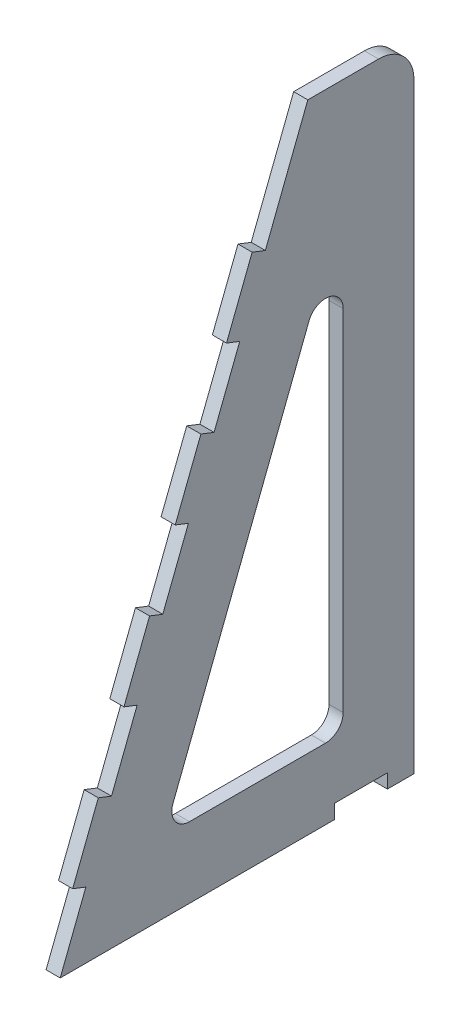
ISO-10303-21;
HEADER;
FILE_DESCRIPTION(('STEP AP214'),'2;1');
FILE_NAME('part.step','',(''),(''),'','','');
FILE_SCHEMA(('AUTOMOTIVE_DESIGN { 1 0 10303 214 1 1 1 1 }'));
ENDSEC;
DATA;
#1=APPLICATION_CONTEXT('core data for automotive mechanical design processes');
#2=APPLICATION_PROTOCOL_DEFINITION('international standard','automotive_design',2000,#1);
#3=PRODUCT_CONTEXT('',#1,'mechanical');
#4=PRODUCT('Part','Part','',(#3));
#5=PRODUCT_RELATED_PRODUCT_CATEGORY('part','',(#4));
#6=PRODUCT_DEFINITION_FORMATION('','',#4);
#7=PRODUCT_DEFINITION_CONTEXT('part definition',#1,'design');
#8=PRODUCT_DEFINITION('design','',#6,#7);
#9=PRODUCT_DEFINITION_SHAPE('','',#8);
#10=(LENGTH_UNIT() NAMED_UNIT(*) SI_UNIT(.MILLI.,.METRE.));
#11=(NAMED_UNIT(*) PLANE_ANGLE_UNIT() SI_UNIT($,.RADIAN.));
#12=(NAMED_UNIT(*) SI_UNIT($,.STERADIAN.) SOLID_ANGLE_UNIT());
#13=UNCERTAINTY_MEASURE_WITH_UNIT(LENGTH_MEASURE(1.E-05),#10,'distance_accuracy_value','');
#14=(GEOMETRIC_REPRESENTATION_CONTEXT(3) GLOBAL_UNCERTAINTY_ASSIGNED_CONTEXT((#13)) GLOBAL_UNIT_ASSIGNED_CONTEXT((#10,
#11,#12)) REPRESENTATION_CONTEXT('',''));
#15=CARTESIAN_POINT('',(0.,0.,0.));
#16=DIRECTION('',(0.,0.,1.));
#17=DIRECTION('',(1.,0.,0.));
#18=AXIS2_PLACEMENT_3D('',#15,#16,#17);
#19=CARTESIAN_POINT('',(4.,0.,0.));
#20=DIRECTION('',(0.,0.362446261154948,0.932004671541296));
#21=DIRECTION('',(0.,-0.932004671541296,0.362446261154948));
#22=AXIS2_PLACEMENT_3D('',#19,#20,#21);
#23=PLANE('',#22);
#24=DIRECTION('',(1.,0.,0.));
#25=VECTOR('',#24,1.);
#26=CARTESIAN_POINT('',(0.,130.480654015781,-50.7424765616928));
#27=LINE('',#26,#25);
#28=CARTESIAN_POINT('',(0.,130.480654015781,-50.7424765616928));
#29=VERTEX_POINT('',#28);
#30=CARTESIAN_POINT('',(4.,130.480654015781,-50.7424765616928));
#31=VERTEX_POINT('',#30);
#32=EDGE_CURVE('E268',#29,#31,#27,.T.);
#33=ORIENTED_EDGE('',*,*,#32,.F.);
#34=DIRECTION('',(0.,0.932004671541296,-0.362446261154948));
#35=VECTOR('',#34,1.);
#36=CARTESIAN_POINT('',(0.,0.,0.));
#37=LINE('',#36,#35);
#38=CARTESIAN_POINT('',(0.,111.840560584955,-43.4935513385938));
#39=VERTEX_POINT('',#38);
#40=EDGE_CURVE('E596',#39,#29,#37,.T.);
#41=ORIENTED_EDGE('',*,*,#40,.F.);
#42=DIRECTION('',(1.,0.,0.));
#43=VECTOR('',#42,1.);
#44=CARTESIAN_POINT('',(0.,111.840560584955,-43.4935513385938));
#45=LINE('',#44,#43);
#46=CARTESIAN_POINT('',(4.,111.840560584955,-43.4935513385938));
#47=VERTEX_POINT('',#46);
#48=EDGE_CURVE('E309',#39,#47,#45,.T.);
#49=ORIENTED_EDGE('',*,*,#48,.T.);
#50=DIRECTION('',(0.,0.932004671541296,-0.362446261154948));
#51=VECTOR('',#50,1.);
#52=CARTESIAN_POINT('',(4.,0.,0.));
#53=LINE('',#52,#51);
#54=EDGE_CURVE('E599',#47,#31,#53,.T.);
#55=ORIENTED_EDGE('',*,*,#54,.T.);
#56=EDGE_LOOP('',(#33,#41,#49,#55));
#57=FACE_BOUND('',#56,.T.);
#58=ADVANCED_FACE('F48',(#57),#23,.T.);
#59=DIRECTION('',(1.,0.,0.));
#60=VECTOR('',#59,1.);
#61=CARTESIAN_POINT('',(0.,93.2004671541295,-36.2446261154949));
#62=LINE('',#61,#60);
#63=CARTESIAN_POINT('',(0.,93.2004671541295,-36.2446261154949));
#64=VERTEX_POINT('',#63);
#65=CARTESIAN_POINT('',(4.,93.2004671541295,-36.2446261154949));
#66=VERTEX_POINT('',#65);
#67=EDGE_CURVE('E305',#64,#66,#62,.T.);
#68=ORIENTED_EDGE('',*,*,#67,.F.);
#69=CARTESIAN_POINT('',(0.,74.5603737233037,-28.9957008923959));
#70=VERTEX_POINT('',#69);
#71=EDGE_CURVE('E633',#70,#64,#37,.T.);
#72=ORIENTED_EDGE('',*,*,#71,.F.);
#73=DIRECTION('',(1.,0.,0.));
#74=VECTOR('',#73,1.);
#75=CARTESIAN_POINT('',(0.,74.5603737233036,-28.9957008923959));
#76=LINE('',#75,#74);
#77=CARTESIAN_POINT('',(4.,74.5603737233036,-28.9957008923959));
#78=VERTEX_POINT('',#77);
#79=EDGE_CURVE('E350',#70,#78,#76,.T.);
#80=ORIENTED_EDGE('',*,*,#79,.T.);
#81=EDGE_CURVE('E601',#78,#66,#53,.T.);
#82=ORIENTED_EDGE('',*,*,#81,.T.);
#83=EDGE_LOOP('',(#68,#72,#80,#82));
#84=FACE_BOUND('',#83,.T.);
#85=ADVANCED_FACE('F660',(#84),#23,.T.);
#86=DIRECTION('',(1.,0.,0.));
#87=VECTOR('',#86,1.);
#88=CARTESIAN_POINT('',(0.,55.9202802924777,-21.7467756692969));
#89=LINE('',#88,#87);
#90=CARTESIAN_POINT('',(0.,55.9202802924777,-21.7467756692969));
#91=VERTEX_POINT('',#90);
#92=CARTESIAN_POINT('',(4.,55.9202802924777,-21.7467756692969));
#93=VERTEX_POINT('',#92);
#94=EDGE_CURVE('E346',#91,#93,#89,.T.);
#95=ORIENTED_EDGE('',*,*,#94,.F.);
#96=CARTESIAN_POINT('',(0.,37.2801868616518,-14.4978504461979));
#97=VERTEX_POINT('',#96);
#98=EDGE_CURVE('E480',#97,#91,#37,.T.);
#99=ORIENTED_EDGE('',*,*,#98,.F.);
#100=DIRECTION('',(1.,0.,0.));
#101=VECTOR('',#100,1.);
#102=CARTESIAN_POINT('',(0.,37.2801868616518,-14.4978504461979));
#103=LINE('',#102,#101);
#104=CARTESIAN_POINT('',(4.,37.2801868616518,-14.4978504461979));
#105=VERTEX_POINT('',#104);
#106=EDGE_CURVE('E399',#97,#105,#103,.T.);
#107=ORIENTED_EDGE('',*,*,#106,.T.);
#108=EDGE_CURVE('E555',#105,#93,#53,.T.);
#109=ORIENTED_EDGE('',*,*,#108,.T.);
#110=EDGE_LOOP('',(#95,#99,#107,#109));
#111=FACE_BOUND('',#110,.T.);
#112=ADVANCED_FACE('F613',(#111),#23,.T.);
#113=DIRECTION('',(1.,0.,0.));
#114=VECTOR('',#113,1.);
#115=CARTESIAN_POINT('',(0.,18.6400934308259,-7.24892522309905));
#116=LINE('',#115,#114);
#117=CARTESIAN_POINT('',(0.,18.6400934308259,-7.24892522309905));
#118=VERTEX_POINT('',#117);
#119=CARTESIAN_POINT('',(4.,18.6400934308259,-7.24892522309905));
#120=VERTEX_POINT('',#119);
#121=EDGE_CURVE('E415',#118,#120,#116,.T.);
#122=ORIENTED_EDGE('',*,*,#121,.F.);
#123=CARTESIAN_POINT('',(0.,0.,0.));
#124=VERTEX_POINT('',#123);
#125=EDGE_CURVE('E476',#124,#118,#37,.T.);
#126=ORIENTED_EDGE('',*,*,#125,.F.);
#127=DIRECTION('',(-1.,0.,0.));
#128=VECTOR('',#127,1.);
#129=CARTESIAN_POINT('',(4.,0.,0.));
#130=LINE('',#129,#128);
#131=CARTESIAN_POINT('',(4.,0.,0.));
#132=VERTEX_POINT('',#131);
#133=EDGE_CURVE('E509',#132,#124,#130,.T.);
#134=ORIENTED_EDGE('',*,*,#133,.F.);
#135=EDGE_CURVE('E550',#132,#120,#53,.T.);
#136=ORIENTED_EDGE('',*,*,#135,.T.);
#137=EDGE_LOOP('',(#122,#126,#134,#136));
#138=FACE_BOUND('',#137,.T.);
#139=ADVANCED_FACE('F669',(#138),#23,.T.);
#140=CARTESIAN_POINT('',(4.,20.,0.));
#141=DIRECTION('',(0.,1.,0.));
#142=DIRECTION('',(0.,0.,1.));
#143=AXIS2_PLACEMENT_3D('',#140,#141,#142);
#144=PLANE('',#143);
#145=DIRECTION('',(0.,0.,-1.));
#146=VECTOR('',#145,1.);
#147=CARTESIAN_POINT('',(0.,20.,0.));
#148=LINE('',#147,#146);
#149=CARTESIAN_POINT('',(0.,20.,-36.5461221053166));
#150=VERTEX_POINT('',#149);
#151=CARTESIAN_POINT('',(0.,20.,-75.));
#152=VERTEX_POINT('',#151);
#153=EDGE_CURVE('E488',#150,#152,#148,.T.);
#154=ORIENTED_EDGE('',*,*,#153,.F.);
#155=DIRECTION('',(-1.,0.,0.));
#156=VECTOR('',#155,1.);
#157=CARTESIAN_POINT('',(4.,20.,-36.5461221053166));
#158=LINE('',#157,#156);
#159=CARTESIAN_POINT('',(4.,20.,-36.5461221053166));
#160=VERTEX_POINT('',#159);
#161=EDGE_CURVE('E750',#150,#160,#158,.F.);
#162=ORIENTED_EDGE('',*,*,#161,.T.);
#163=DIRECTION('',(0.,0.,-1.));
#164=VECTOR('',#163,1.);
#165=CARTESIAN_POINT('',(4.,20.,0.));
#166=LINE('',#165,#164);
#167=CARTESIAN_POINT('',(4.,20.,-75.));
#168=VERTEX_POINT('',#167);
#169=EDGE_CURVE('E445',#160,#168,#166,.T.);
#170=ORIENTED_EDGE('',*,*,#169,.T.);
#171=DIRECTION('',(-1.,0.,0.));
#172=VECTOR('',#171,1.);
#173=CARTESIAN_POINT('',(0.,20.,-75.));
#174=LINE('',#173,#172);
#175=EDGE_CURVE('E729',#168,#152,#174,.T.);
#176=ORIENTED_EDGE('',*,*,#175,.T.);
#177=EDGE_LOOP('',(#154,#162,#170,#176));
#178=FACE_BOUND('',#177,.T.);
#179=ADVANCED_FACE('F679',(#178),#144,.T.);
#180=CARTESIAN_POINT('',(4.,-7.24892522309897,-18.6400934308259));
#181=DIRECTION('',(0.,0.362446261154948,0.932004671541296));
#182=DIRECTION('',(0.,-0.932004671541296,0.362446261154948));
#183=AXIS2_PLACEMENT_3D('',#180,#181,#182);
#184=PLANE('',#183);
#185=DIRECTION('',(0.,0.932004671541296,-0.362446261154948));
#186=VECTOR('',#185,1.);
#187=CARTESIAN_POINT('',(4.,-7.24892522309897,-18.6400934308259));
#188=LINE('',#187,#186);
#189=CARTESIAN_POINT('',(4.,26.8122313057747,-31.8860987476101));
#190=VERTEX_POINT('',#189);
#191=CARTESIAN_POINT('',(4.,125.693631606389,-70.3399766422935));
#192=VERTEX_POINT('',#191);
#193=EDGE_CURVE('E449',#190,#192,#188,.T.);
#194=ORIENTED_EDGE('',*,*,#193,.F.);
#195=DIRECTION('',(-1.,0.,0.));
#196=VECTOR('',#195,1.);
#197=CARTESIAN_POINT('',(4.,26.8122313057747,-31.8860987476101));
#198=LINE('',#197,#196);
#199=CARTESIAN_POINT('',(0.,26.8122313057747,-31.8860987476101));
#200=VERTEX_POINT('',#199);
#201=EDGE_CURVE('E754',#190,#200,#198,.T.);
#202=ORIENTED_EDGE('',*,*,#201,.T.);
#203=DIRECTION('',(0.,0.932004671541296,-0.362446261154948));
#204=VECTOR('',#203,1.);
#205=CARTESIAN_POINT('',(0.,-7.24892522309897,-18.6400934308259));
#206=LINE('',#205,#204);
#207=CARTESIAN_POINT('',(0.,125.693631606389,-70.3399766422935));
#208=VERTEX_POINT('',#207);
#209=EDGE_CURVE('E492',#200,#208,#206,.T.);
#210=ORIENTED_EDGE('',*,*,#209,.T.);
#211=DIRECTION('',(-1.,0.,0.));
#212=VECTOR('',#211,1.);
#213=CARTESIAN_POINT('',(4.,125.693631606389,-70.3399766422935));
#214=LINE('',#213,#212);
#215=EDGE_CURVE('E537',#208,#192,#214,.F.);
#216=ORIENTED_EDGE('',*,*,#215,.T.);
#217=EDGE_LOOP('',(#194,#202,#210,#216));
#218=FACE_BOUND('',#217,.T.);
#219=ADVANCED_FACE('F685',(#218),#184,.F.);
#220=CARTESIAN_POINT('',(4.,0.,-92.5));
#221=DIRECTION('',(0.,0.,1.));
#222=DIRECTION('',(1.,0.,0.));
#223=AXIS2_PLACEMENT_3D('',#220,#221,#222);
#224=PLANE('',#223);
#225=DIRECTION('',(0.,1.,0.));
#226=VECTOR('',#225,1.);
#227=CARTESIAN_POINT('',(0.,0.,-92.5));
#228=LINE('',#227,#226);
#229=CARTESIAN_POINT('',(0.,0.,-92.5));
#230=VERTEX_POINT('',#229);
#231=CARTESIAN_POINT('',(0.,4.,-92.5));
#232=VERTEX_POINT('',#231);
#233=EDGE_CURVE('E418',#230,#232,#228,.T.);
#234=ORIENTED_EDGE('',*,*,#233,.F.);
#235=DIRECTION('',(-1.,0.,0.));
#236=VECTOR('',#235,1.);
#237=CARTESIAN_POINT('',(4.,0.,-92.5));
#238=LINE('',#237,#236);
#239=CARTESIAN_POINT('',(4.,0.,-92.5));
#240=VERTEX_POINT('',#239);
#241=EDGE_CURVE('E520',#240,#230,#238,.T.);
#242=ORIENTED_EDGE('',*,*,#241,.F.);
#243=DIRECTION('',(0.,1.,0.));
#244=VECTOR('',#243,1.);
#245=CARTESIAN_POINT('',(4.,0.,-92.5));
#246=LINE('',#245,#244);
#247=CARTESIAN_POINT('',(4.,4.,-92.5));
#248=VERTEX_POINT('',#247);
#249=EDGE_CURVE('E428',#240,#248,#246,.T.);
#250=ORIENTED_EDGE('',*,*,#249,.T.);
#251=DIRECTION('',(-1.,0.,0.));
#252=VECTOR('',#251,1.);
#253=CARTESIAN_POINT('',(4.,4.,-92.5));
#254=LINE('',#253,#252);
#255=EDGE_CURVE('E459',#248,#232,#254,.T.);
#256=ORIENTED_EDGE('',*,*,#255,.T.);
#257=EDGE_LOOP('',(#234,#242,#250,#256));
#258=FACE_BOUND('',#257,.T.);
#259=ADVANCED_FACE('F705',(#258),#224,.T.);
#260=CARTESIAN_POINT('',(4.,0.,0.));
#261=DIRECTION('',(0.,1.,0.));
#262=DIRECTION('',(0.,0.,1.));
#263=AXIS2_PLACEMENT_3D('',#260,#261,#262);
#264=PLANE('',#263);
#265=DIRECTION('',(0.,0.,-1.));
#266=VECTOR('',#265,1.);
#267=CARTESIAN_POINT('',(0.,0.,0.));
#268=LINE('',#267,#266);
#269=CARTESIAN_POINT('',(0.,0.,-100.));
#270=VERTEX_POINT('',#269);
#271=EDGE_CURVE('E463',#230,#270,#268,.T.);
#272=ORIENTED_EDGE('',*,*,#271,.T.);
#273=DIRECTION('',(-1.,0.,0.));
#274=VECTOR('',#273,1.);
#275=CARTESIAN_POINT('',(4.,0.,-100.));
#276=LINE('',#275,#274);
#277=CARTESIAN_POINT('',(4.,0.,-100.));
#278=VERTEX_POINT('',#277);
#279=EDGE_CURVE('E516',#278,#270,#276,.T.);
#280=ORIENTED_EDGE('',*,*,#279,.F.);
#281=DIRECTION('',(0.,0.,-1.));
#282=VECTOR('',#281,1.);
#283=CARTESIAN_POINT('',(4.,0.,0.));
#284=LINE('',#283,#282);
#285=EDGE_CURVE('E433',#240,#278,#284,.T.);
#286=ORIENTED_EDGE('',*,*,#285,.F.);
#287=ORIENTED_EDGE('',*,*,#241,.T.);
#288=EDGE_LOOP('',(#272,#280,#286,#287));
#289=FACE_BOUND('',#288,.T.);
#290=ADVANCED_FACE('F676',(#289),#264,.F.);
#291=CARTESIAN_POINT('',(4.,0.,-100.));
#292=DIRECTION('',(0.,0.,1.));
#293=DIRECTION('',(1.,0.,0.));
#294=AXIS2_PLACEMENT_3D('',#291,#292,#293);
#295=PLANE('',#294);
#296=DIRECTION('',(0.,1.,0.));
#297=VECTOR('',#296,1.);
#298=CARTESIAN_POINT('',(0.,0.,-100.));
#299=LINE('',#298,#297);
#300=CARTESIAN_POINT('',(0.,170.,-100.));
#301=VERTEX_POINT('',#300);
#302=EDGE_CURVE('E466',#270,#301,#299,.T.);
#303=ORIENTED_EDGE('',*,*,#302,.T.);
#304=DIRECTION('',(-1.,0.,0.));
#305=VECTOR('',#304,1.);
#306=CARTESIAN_POINT('',(4.,170.,-100.));
#307=LINE('',#306,#305);
#308=CARTESIAN_POINT('',(4.,170.,-100.));
#309=VERTEX_POINT('',#308);
#310=EDGE_CURVE('E530',#301,#309,#307,.F.);
#311=ORIENTED_EDGE('',*,*,#310,.T.);
#312=DIRECTION('',(0.,1.,0.));
#313=VECTOR('',#312,1.);
#314=CARTESIAN_POINT('',(4.,0.,-100.));
#315=LINE('',#314,#313);
#316=EDGE_CURVE('E548',#278,#309,#315,.T.);
#317=ORIENTED_EDGE('',*,*,#316,.F.);
#318=ORIENTED_EDGE('',*,*,#279,.T.);
#319=EDGE_LOOP('',(#303,#311,#317,#318));
#320=FACE_BOUND('',#319,.T.);
#321=ADVANCED_FACE('F677',(#320),#295,.F.);
#322=CARTESIAN_POINT('',(4.,180.,0.));
#323=DIRECTION('',(0.,1.,0.));
#324=DIRECTION('',(0.,0.,1.));
#325=AXIS2_PLACEMENT_3D('',#322,#323,#324);
#326=PLANE('',#325);
#327=DIRECTION('',(0.,0.,-1.));
#328=VECTOR('',#327,1.);
#329=CARTESIAN_POINT('',(4.,180.,0.));
#330=LINE('',#329,#328);
#331=CARTESIAN_POINT('',(4.,180.,-70.));
#332=VERTEX_POINT('',#331);
#333=CARTESIAN_POINT('',(4.,180.,-90.));
#334=VERTEX_POINT('',#333);
#335=EDGE_CURVE('E543',#332,#334,#330,.T.);
#336=ORIENTED_EDGE('',*,*,#335,.T.);
#337=DIRECTION('',(-1.,0.,0.));
#338=VECTOR('',#337,1.);
#339=CARTESIAN_POINT('',(0.,180.,-90.));
#340=LINE('',#339,#338);
#341=CARTESIAN_POINT('',(0.,180.,-90.));
#342=VERTEX_POINT('',#341);
#343=EDGE_CURVE('E523',#334,#342,#340,.T.);
#344=ORIENTED_EDGE('',*,*,#343,.T.);
#345=DIRECTION('',(0.,0.,-1.));
#346=VECTOR('',#345,1.);
#347=CARTESIAN_POINT('',(0.,180.,0.));
#348=LINE('',#347,#346);
#349=CARTESIAN_POINT('',(0.,180.,-70.));
#350=VERTEX_POINT('',#349);
#351=EDGE_CURVE('E471',#350,#342,#348,.T.);
#352=ORIENTED_EDGE('',*,*,#351,.F.);
#353=DIRECTION('',(-1.,0.,0.));
#354=VECTOR('',#353,1.);
#355=CARTESIAN_POINT('',(4.,180.,-70.));
#356=LINE('',#355,#354);
#357=EDGE_CURVE('E512',#332,#350,#356,.T.);
#358=ORIENTED_EDGE('',*,*,#357,.F.);
#359=EDGE_LOOP('',(#336,#344,#352,#358));
#360=FACE_BOUND('',#359,.T.);
#361=ADVANCED_FACE('F585',(#360),#326,.T.);
#362=DIRECTION('',(1.,0.,0.));
#363=VECTOR('',#362,1.);
#364=CARTESIAN_POINT('',(0.,149.120747446607,-57.9914017847917));
#365=LINE('',#364,#363);
#366=CARTESIAN_POINT('',(0.,149.120747446607,-57.9914017847917));
#367=VERTEX_POINT('',#366);
#368=CARTESIAN_POINT('',(4.,149.120747446607,-57.9914017847917));
#369=VERTEX_POINT('',#368);
#370=EDGE_CURVE('E642',#367,#369,#365,.T.);
#371=ORIENTED_EDGE('',*,*,#370,.T.);
#372=EDGE_CURVE('E547',#369,#332,#53,.T.);
#373=ORIENTED_EDGE('',*,*,#372,.T.);
#374=ORIENTED_EDGE('',*,*,#357,.T.);
#375=EDGE_CURVE('E475',#367,#350,#37,.T.);
#376=ORIENTED_EDGE('',*,*,#375,.F.);
#377=EDGE_LOOP('',(#371,#373,#374,#376));
#378=FACE_BOUND('',#377,.T.);
#379=ADVANCED_FACE('F597',(#378),#23,.T.);
#380=CARTESIAN_POINT('',(0.,0.,-77.5));
#381=VERTEX_POINT('',#380);
#382=EDGE_CURVE('E467',#124,#381,#268,.T.);
#383=ORIENTED_EDGE('',*,*,#382,.T.);
#384=DIRECTION('',(-1.,0.,0.));
#385=VECTOR('',#384,1.);
#386=CARTESIAN_POINT('',(4.,0.,-77.5));
#387=LINE('',#386,#385);
#388=CARTESIAN_POINT('',(4.,0.,-77.5));
#389=VERTEX_POINT('',#388);
#390=EDGE_CURVE('E505',#389,#381,#387,.T.);
#391=ORIENTED_EDGE('',*,*,#390,.F.);
#392=EDGE_CURVE('E554',#132,#389,#284,.T.);
#393=ORIENTED_EDGE('',*,*,#392,.F.);
#394=ORIENTED_EDGE('',*,*,#133,.T.);
#395=EDGE_LOOP('',(#383,#391,#393,#394));
#396=FACE_BOUND('',#395,.T.);
#397=ADVANCED_FACE('F668',(#396),#264,.F.);
#398=CARTESIAN_POINT('',(4.,0.,-77.5));
#399=DIRECTION('',(0.,0.,1.));
#400=DIRECTION('',(1.,0.,0.));
#401=AXIS2_PLACEMENT_3D('',#398,#399,#400);
#402=PLANE('',#401);
#403=DIRECTION('',(0.,1.,0.));
#404=VECTOR('',#403,1.);
#405=CARTESIAN_POINT('',(0.,0.,-77.5));
#406=LINE('',#405,#404);
#407=CARTESIAN_POINT('',(0.,4.,-77.5));
#408=VERTEX_POINT('',#407);
#409=EDGE_CURVE('E481',#381,#408,#406,.T.);
#410=ORIENTED_EDGE('',*,*,#409,.T.);
#411=DIRECTION('',(-1.,0.,0.));
#412=VECTOR('',#411,1.);
#413=CARTESIAN_POINT('',(4.,4.,-77.5));
#414=LINE('',#413,#412);
#415=CARTESIAN_POINT('',(4.,4.,-77.5));
#416=VERTEX_POINT('',#415);
#417=EDGE_CURVE('E501',#416,#408,#414,.T.);
#418=ORIENTED_EDGE('',*,*,#417,.F.);
#419=DIRECTION('',(0.,1.,0.));
#420=VECTOR('',#419,1.);
#421=CARTESIAN_POINT('',(4.,0.,-77.5));
#422=LINE('',#421,#420);
#423=EDGE_CURVE('E556',#389,#416,#422,.T.);
#424=ORIENTED_EDGE('',*,*,#423,.F.);
#425=ORIENTED_EDGE('',*,*,#390,.T.);
#426=EDGE_LOOP('',(#410,#418,#424,#425));
#427=FACE_BOUND('',#426,.T.);
#428=ADVANCED_FACE('F674',(#427),#402,.F.);
#429=CARTESIAN_POINT('',(4.,4.,0.));
#430=DIRECTION('',(0.,1.,0.));
#431=DIRECTION('',(0.,0.,1.));
#432=AXIS2_PLACEMENT_3D('',#429,#430,#431);
#433=PLANE('',#432);
#434=DIRECTION('',(0.,0.,-1.));
#435=VECTOR('',#434,1.);
#436=CARTESIAN_POINT('',(0.,4.,0.));
#437=LINE('',#436,#435);
#438=EDGE_CURVE('E484',#408,#232,#437,.T.);
#439=ORIENTED_EDGE('',*,*,#438,.T.);
#440=ORIENTED_EDGE('',*,*,#255,.F.);
#441=DIRECTION('',(0.,0.,-1.));
#442=VECTOR('',#441,1.);
#443=CARTESIAN_POINT('',(4.,4.,0.));
#444=LINE('',#443,#442);
#445=EDGE_CURVE('E450',#416,#248,#444,.T.);
#446=ORIENTED_EDGE('',*,*,#445,.F.);
#447=ORIENTED_EDGE('',*,*,#417,.T.);
#448=EDGE_LOOP('',(#439,#440,#446,#447));
#449=FACE_BOUND('',#448,.T.);
#450=ADVANCED_FACE('F702',(#449),#433,.F.);
#451=CARTESIAN_POINT('',(4.,0.,-80.));
#452=DIRECTION('',(0.,0.,1.));
#453=DIRECTION('',(1.,0.,0.));
#454=AXIS2_PLACEMENT_3D('',#451,#452,#453);
#455=PLANE('',#454);
#456=DIRECTION('',(0.,1.,0.));
#457=VECTOR('',#456,1.);
#458=CARTESIAN_POINT('',(0.,0.,-80.));
#459=LINE('',#458,#457);
#460=CARTESIAN_POINT('',(0.,25.,-80.));
#461=VERTEX_POINT('',#460);
#462=CARTESIAN_POINT('',(0.,123.881400300614,-80.));
#463=VERTEX_POINT('',#462);
#464=EDGE_CURVE('E434',#461,#463,#459,.T.);
#465=ORIENTED_EDGE('',*,*,#464,.F.);
#466=DIRECTION('',(-1.,0.,0.));
#467=VECTOR('',#466,1.);
#468=CARTESIAN_POINT('',(4.,25.,-80.));
#469=LINE('',#468,#467);
#470=CARTESIAN_POINT('',(4.,25.,-80.));
#471=VERTEX_POINT('',#470);
#472=EDGE_CURVE('E69',#461,#471,#469,.F.);
#473=ORIENTED_EDGE('',*,*,#472,.T.);
#474=DIRECTION('',(0.,1.,0.));
#475=VECTOR('',#474,1.);
#476=CARTESIAN_POINT('',(4.,0.,-80.));
#477=LINE('',#476,#475);
#478=CARTESIAN_POINT('',(4.,123.881400300614,-80.));
#479=VERTEX_POINT('',#478);
#480=EDGE_CURVE('E455',#471,#479,#477,.T.);
#481=ORIENTED_EDGE('',*,*,#480,.T.);
#482=DIRECTION('',(-1.,0.,0.));
#483=VECTOR('',#482,1.);
#484=CARTESIAN_POINT('',(4.,123.881400300614,-80.));
#485=LINE('',#484,#483);
#486=EDGE_CURVE('E746',#479,#463,#485,.T.);
#487=ORIENTED_EDGE('',*,*,#486,.T.);
#488=EDGE_LOOP('',(#465,#473,#481,#487));
#489=FACE_BOUND('',#488,.T.);
#490=ADVANCED_FACE('F765',(#489),#455,.T.);
#491=CARTESIAN_POINT('',(4.,0.,0.));
#492=DIRECTION('',(1.,0.,0.));
#493=DIRECTION('',(0.,0.,-1.));
#494=AXIS2_PLACEMENT_3D('',#491,#492,#493);
#495=PLANE('',#494);
#496=ORIENTED_EDGE('',*,*,#316,.T.);
#497=CARTESIAN_POINT('',(4.,170.,-90.));
#498=DIRECTION('',(1.,0.,0.));
#499=DIRECTION('',(0.,0.,-1.));
#500=AXIS2_PLACEMENT_3D('',#497,#498,#499);
#501=CIRCLE('',#500,10.);
#502=EDGE_CURVE('E533',#309,#334,#501,.T.);
#503=ORIENTED_EDGE('',*,*,#502,.T.);
#504=ORIENTED_EDGE('',*,*,#335,.F.);
#505=ORIENTED_EDGE('',*,*,#372,.F.);
#506=DIRECTION('',(0.,0.362446261154947,0.932004671541297));
#507=VECTOR('',#506,1.);
#508=CARTESIAN_POINT('',(4.,150.570532491227,-54.2633830986265));
#509=LINE('',#508,#507);
#510=CARTESIAN_POINT('',(4.,150.570532491227,-54.2633830986265));
#511=VERTEX_POINT('',#510);
#512=EDGE_CURVE('E274',#369,#511,#509,.T.);
#513=ORIENTED_EDGE('',*,*,#512,.T.);
#514=DIRECTION('',(0.,-0.932004671541297,0.362446261154947));
#515=VECTOR('',#514,1.);
#516=CARTESIAN_POINT('',(4.,131.930439060401,-47.0144578755276));
#517=LINE('',#516,#515);
#518=CARTESIAN_POINT('',(4.,131.930439060401,-47.0144578755276));
#519=VERTEX_POINT('',#518);
#520=EDGE_CURVE('E256',#511,#519,#517,.T.);
#521=ORIENTED_EDGE('',*,*,#520,.T.);
#522=DIRECTION('',(0.,-0.362446261154947,-0.932004671541297));
#523=VECTOR('',#522,1.);
#524=CARTESIAN_POINT('',(4.,130.480654015781,-50.7424765616928));
#525=LINE('',#524,#523);
#526=EDGE_CURVE('E265',#519,#31,#525,.T.);
#527=ORIENTED_EDGE('',*,*,#526,.T.);
#528=ORIENTED_EDGE('',*,*,#54,.F.);
#529=DIRECTION('',(0.,0.362446261154944,0.932004671541298));
#530=VECTOR('',#529,1.);
#531=CARTESIAN_POINT('',(4.,113.290345629575,-39.7655326524286));
#532=LINE('',#531,#530);
#533=CARTESIAN_POINT('',(4.,113.290345629575,-39.7655326524286));
#534=VERTEX_POINT('',#533);
#535=EDGE_CURVE('E323',#47,#534,#532,.T.);
#536=ORIENTED_EDGE('',*,*,#535,.T.);
#537=DIRECTION('',(0.,-0.932004671541297,0.362446261154947));
#538=VECTOR('',#537,1.);
#539=CARTESIAN_POINT('',(4.,94.6502521987493,-32.5166074293297));
#540=LINE('',#539,#538);
#541=CARTESIAN_POINT('',(4.,94.6502521987493,-32.5166074293297));
#542=VERTEX_POINT('',#541);
#543=EDGE_CURVE('E318',#534,#542,#540,.T.);
#544=ORIENTED_EDGE('',*,*,#543,.T.);
#545=DIRECTION('',(0.,-0.362446261154944,-0.932004671541298));
#546=VECTOR('',#545,1.);
#547=CARTESIAN_POINT('',(4.,93.2004671541295,-36.2446261154949));
#548=LINE('',#547,#546);
#549=EDGE_CURVE('E331',#542,#66,#548,.T.);
#550=ORIENTED_EDGE('',*,*,#549,.T.);
#551=ORIENTED_EDGE('',*,*,#81,.F.);
#552=DIRECTION('',(0.,0.362446261154944,0.932004671541298));
#553=VECTOR('',#552,1.);
#554=CARTESIAN_POINT('',(4.,76.0101587679234,-25.2676822062307));
#555=LINE('',#554,#553);
#556=CARTESIAN_POINT('',(4.,76.0101587679234,-25.2676822062307));
#557=VERTEX_POINT('',#556);
#558=EDGE_CURVE('E364',#78,#557,#555,.T.);
#559=ORIENTED_EDGE('',*,*,#558,.T.);
#560=DIRECTION('',(0.,-0.932004671541297,0.362446261154947));
#561=VECTOR('',#560,1.);
#562=CARTESIAN_POINT('',(4.,57.3700653370975,-18.0187569831317));
#563=LINE('',#562,#561);
#564=CARTESIAN_POINT('',(4.,57.3700653370975,-18.0187569831317));
#565=VERTEX_POINT('',#564);
#566=EDGE_CURVE('E359',#557,#565,#563,.T.);
#567=ORIENTED_EDGE('',*,*,#566,.T.);
#568=DIRECTION('',(0.,-0.362446261154944,-0.932004671541298));
#569=VECTOR('',#568,1.);
#570=CARTESIAN_POINT('',(4.,55.9202802924777,-21.7467756692969));
#571=LINE('',#570,#569);
#572=EDGE_CURVE('E372',#565,#93,#571,.T.);
#573=ORIENTED_EDGE('',*,*,#572,.T.);
#574=ORIENTED_EDGE('',*,*,#108,.F.);
#575=DIRECTION('',(0.,0.362446261154946,0.932004671541297));
#576=VECTOR('',#575,1.);
#577=CARTESIAN_POINT('',(4.,38.7299719062716,-10.7698317600328));
#578=LINE('',#577,#576);
#579=CARTESIAN_POINT('',(4.,38.7299719062716,-10.7698317600328));
#580=VERTEX_POINT('',#579);
#581=EDGE_CURVE('E377',#105,#580,#578,.T.);
#582=ORIENTED_EDGE('',*,*,#581,.T.);
#583=DIRECTION('',(0.,-0.932004671541297,0.362446261154945));
#584=VECTOR('',#583,1.);
#585=CARTESIAN_POINT('',(4.,20.0898784754457,-3.52090653693386));
#586=LINE('',#585,#584);
#587=CARTESIAN_POINT('',(4.,20.0898784754457,-3.52090653693386));
#588=VERTEX_POINT('',#587);
#589=EDGE_CURVE('E404',#580,#588,#586,.T.);
#590=ORIENTED_EDGE('',*,*,#589,.T.);
#591=DIRECTION('',(0.,-0.362446261154946,-0.932004671541297));
#592=VECTOR('',#591,1.);
#593=CARTESIAN_POINT('',(4.,18.6400934308259,-7.24892522309905));
#594=LINE('',#593,#592);
#595=EDGE_CURVE('E392',#588,#120,#594,.T.);
#596=ORIENTED_EDGE('',*,*,#595,.T.);
#597=ORIENTED_EDGE('',*,*,#135,.F.);
#598=ORIENTED_EDGE('',*,*,#392,.T.);
#599=ORIENTED_EDGE('',*,*,#423,.T.);
#600=ORIENTED_EDGE('',*,*,#445,.T.);
#601=ORIENTED_EDGE('',*,*,#249,.F.);
#602=ORIENTED_EDGE('',*,*,#285,.T.);
#603=EDGE_LOOP('',(#496,#503,#504,#505,#513,#521,#527,#528,#536,#544,#550,#551,#559,#567,#573,
#574,#582,#590,#596,#597,#598,#599,#600,#601,#602));
#604=FACE_BOUND('',#603,.T.);
#605=ORIENTED_EDGE('',*,*,#169,.F.);
#606=CARTESIAN_POINT('',(4.,25.,-36.5461221053166));
#607=DIRECTION('',(1.,0.,0.));
#608=DIRECTION('',(0.,0.,-1.));
#609=AXIS2_PLACEMENT_3D('',#606,#607,#608);
#610=CIRCLE('',#609,5.);
#611=EDGE_CURVE('E736',#160,#190,#610,.F.);
#612=ORIENTED_EDGE('',*,*,#611,.T.);
#613=ORIENTED_EDGE('',*,*,#193,.T.);
#614=CARTESIAN_POINT('',(4.,123.881400300614,-75.));
#615=DIRECTION('',(1.,0.,0.));
#616=DIRECTION('',(0.,0.,-1.));
#617=AXIS2_PLACEMENT_3D('',#614,#615,#616);
#618=CIRCLE('',#617,5.);
#619=EDGE_CURVE('E12',#192,#479,#618,.F.);
#620=ORIENTED_EDGE('',*,*,#619,.T.);
#621=ORIENTED_EDGE('',*,*,#480,.F.);
#622=CARTESIAN_POINT('',(4.,25.,-75.));
#623=DIRECTION('',(1.,0.,0.));
#624=DIRECTION('',(0.,0.,-1.));
#625=AXIS2_PLACEMENT_3D('',#622,#623,#624);
#626=CIRCLE('',#625,5.);
#627=EDGE_CURVE('E727',#471,#168,#626,.F.);
#628=ORIENTED_EDGE('',*,*,#627,.T.);
#629=EDGE_LOOP('',(#605,#612,#613,#620,#621,#628));
#630=FACE_BOUND('',#629,.T.);
#631=ADVANCED_FACE('F278',(#604,#630),#495,.T.);
#632=CARTESIAN_POINT('',(0.,0.,0.));
#633=DIRECTION('',(1.,0.,0.));
#634=DIRECTION('',(0.,0.,-1.));
#635=AXIS2_PLACEMENT_3D('',#632,#633,#634);
#636=PLANE('',#635);
#637=ORIENTED_EDGE('',*,*,#351,.T.);
#638=CARTESIAN_POINT('',(0.,170.,-90.));
#639=DIRECTION('',(1.,0.,0.));
#640=DIRECTION('',(0.,0.,-1.));
#641=AXIS2_PLACEMENT_3D('',#638,#639,#640);
#642=CIRCLE('',#641,10.);
#643=EDGE_CURVE('E527',#342,#301,#642,.F.);
#644=ORIENTED_EDGE('',*,*,#643,.T.);
#645=ORIENTED_EDGE('',*,*,#302,.F.);
#646=ORIENTED_EDGE('',*,*,#271,.F.);
#647=ORIENTED_EDGE('',*,*,#233,.T.);
#648=ORIENTED_EDGE('',*,*,#438,.F.);
#649=ORIENTED_EDGE('',*,*,#409,.F.);
#650=ORIENTED_EDGE('',*,*,#382,.F.);
#651=ORIENTED_EDGE('',*,*,#125,.T.);
#652=DIRECTION('',(0.,-0.362446261154946,-0.932004671541297));
#653=VECTOR('',#652,1.);
#654=CARTESIAN_POINT('',(0.,18.6400934308259,-7.24892522309905));
#655=LINE('',#654,#653);
#656=CARTESIAN_POINT('',(0.,20.0898784754457,-3.52090653693386));
#657=VERTEX_POINT('',#656);
#658=EDGE_CURVE('E396',#657,#118,#655,.T.);
#659=ORIENTED_EDGE('',*,*,#658,.F.);
#660=DIRECTION('',(0.,-0.932004671541297,0.362446261154945));
#661=VECTOR('',#660,1.);
#662=CARTESIAN_POINT('',(0.,20.0898784754457,-3.52090653693386));
#663=LINE('',#662,#661);
#664=CARTESIAN_POINT('',(0.,38.7299719062716,-10.7698317600328));
#665=VERTEX_POINT('',#664);
#666=EDGE_CURVE('E391',#665,#657,#663,.T.);
#667=ORIENTED_EDGE('',*,*,#666,.F.);
#668=DIRECTION('',(0.,0.362446261154946,0.932004671541297));
#669=VECTOR('',#668,1.);
#670=CARTESIAN_POINT('',(0.,38.7299719062716,-10.7698317600328));
#671=LINE('',#670,#669);
#672=EDGE_CURVE('E387',#97,#665,#671,.T.);
#673=ORIENTED_EDGE('',*,*,#672,.F.);
#674=ORIENTED_EDGE('',*,*,#98,.T.);
#675=DIRECTION('',(0.,-0.362446261154944,-0.932004671541298));
#676=VECTOR('',#675,1.);
#677=CARTESIAN_POINT('',(0.,55.9202802924777,-21.7467756692969));
#678=LINE('',#677,#676);
#679=CARTESIAN_POINT('',(0.,57.3700653370975,-18.0187569831317));
#680=VERTEX_POINT('',#679);
#681=EDGE_CURVE('E365',#680,#91,#678,.T.);
#682=ORIENTED_EDGE('',*,*,#681,.F.);
#683=DIRECTION('',(0.,-0.932004671541297,0.362446261154947));
#684=VECTOR('',#683,1.);
#685=CARTESIAN_POINT('',(0.,57.3700653370975,-18.0187569831317));
#686=LINE('',#685,#684);
#687=CARTESIAN_POINT('',(0.,76.0101587679234,-25.2676822062307));
#688=VERTEX_POINT('',#687);
#689=EDGE_CURVE('E349',#688,#680,#686,.T.);
#690=ORIENTED_EDGE('',*,*,#689,.F.);
#691=DIRECTION('',(0.,0.362446261154944,0.932004671541298));
#692=VECTOR('',#691,1.);
#693=CARTESIAN_POINT('',(0.,76.0101587679234,-25.2676822062307));
#694=LINE('',#693,#692);
#695=EDGE_CURVE('E381',#70,#688,#694,.T.);
#696=ORIENTED_EDGE('',*,*,#695,.F.);
#697=ORIENTED_EDGE('',*,*,#71,.T.);
#698=DIRECTION('',(0.,-0.362446261154944,-0.932004671541298));
#699=VECTOR('',#698,1.);
#700=CARTESIAN_POINT('',(0.,93.2004671541295,-36.2446261154949));
#701=LINE('',#700,#699);
#702=CARTESIAN_POINT('',(0.,94.6502521987493,-32.5166074293297));
#703=VERTEX_POINT('',#702);
#704=EDGE_CURVE('E324',#703,#64,#701,.T.);
#705=ORIENTED_EDGE('',*,*,#704,.F.);
#706=DIRECTION('',(0.,-0.932004671541297,0.362446261154947));
#707=VECTOR('',#706,1.);
#708=CARTESIAN_POINT('',(0.,94.6502521987493,-32.5166074293297));
#709=LINE('',#708,#707);
#710=CARTESIAN_POINT('',(0.,113.290345629575,-39.7655326524286));
#711=VERTEX_POINT('',#710);
#712=EDGE_CURVE('E308',#711,#703,#709,.T.);
#713=ORIENTED_EDGE('',*,*,#712,.F.);
#714=DIRECTION('',(0.,0.362446261154944,0.932004671541298));
#715=VECTOR('',#714,1.);
#716=CARTESIAN_POINT('',(0.,113.290345629575,-39.7655326524286));
#717=LINE('',#716,#715);
#718=EDGE_CURVE('E340',#39,#711,#717,.T.);
#719=ORIENTED_EDGE('',*,*,#718,.F.);
#720=ORIENTED_EDGE('',*,*,#40,.T.);
#721=DIRECTION('',(0.,-0.362446261154947,-0.932004671541297));
#722=VECTOR('',#721,1.);
#723=CARTESIAN_POINT('',(0.,130.480654015781,-50.7424765616928));
#724=LINE('',#723,#722);
#725=CARTESIAN_POINT('',(0.,131.930439060401,-47.0144578755276));
#726=VERTEX_POINT('',#725);
#727=EDGE_CURVE('E281',#726,#29,#724,.T.);
#728=ORIENTED_EDGE('',*,*,#727,.F.);
#729=DIRECTION('',(0.,-0.932004671541297,0.362446261154947));
#730=VECTOR('',#729,1.);
#731=CARTESIAN_POINT('',(0.,131.930439060401,-47.0144578755276));
#732=LINE('',#731,#730);
#733=CARTESIAN_POINT('',(0.,150.570532491227,-54.2633830986265));
#734=VERTEX_POINT('',#733);
#735=EDGE_CURVE('E258',#734,#726,#732,.T.);
#736=ORIENTED_EDGE('',*,*,#735,.F.);
#737=DIRECTION('',(0.,0.362446261154947,0.932004671541297));
#738=VECTOR('',#737,1.);
#739=CARTESIAN_POINT('',(0.,150.570532491227,-54.2633830986265));
#740=LINE('',#739,#738);
#741=EDGE_CURVE('E286',#367,#734,#740,.T.);
#742=ORIENTED_EDGE('',*,*,#741,.F.);
#743=ORIENTED_EDGE('',*,*,#375,.T.);
#744=EDGE_LOOP('',(#637,#644,#645,#646,#647,#648,#649,#650,#651,#659,#667,#673,#674,#682,#690,
#696,#697,#705,#713,#719,#720,#728,#736,#742,#743));
#745=FACE_BOUND('',#744,.T.);
#746=ORIENTED_EDGE('',*,*,#209,.F.);
#747=CARTESIAN_POINT('',(0.,25.,-36.5461221053166));
#748=DIRECTION('',(1.,0.,0.));
#749=DIRECTION('',(0.,0.,-1.));
#750=AXIS2_PLACEMENT_3D('',#747,#748,#749);
#751=CIRCLE('',#750,5.);
#752=EDGE_CURVE('E741',#200,#150,#751,.T.);
#753=ORIENTED_EDGE('',*,*,#752,.T.);
#754=ORIENTED_EDGE('',*,*,#153,.T.);
#755=CARTESIAN_POINT('',(0.,25.,-75.));
#756=DIRECTION('',(1.,0.,0.));
#757=DIRECTION('',(0.,0.,-1.));
#758=AXIS2_PLACEMENT_3D('',#755,#756,#757);
#759=CIRCLE('',#758,5.);
#760=EDGE_CURVE('E732',#152,#461,#759,.T.);
#761=ORIENTED_EDGE('',*,*,#760,.T.);
#762=ORIENTED_EDGE('',*,*,#464,.T.);
#763=CARTESIAN_POINT('',(0.,123.881400300614,-75.));
#764=DIRECTION('',(1.,0.,0.));
#765=DIRECTION('',(0.,0.,-1.));
#766=AXIS2_PLACEMENT_3D('',#763,#764,#765);
#767=CIRCLE('',#766,5.);
#768=EDGE_CURVE('E57',#463,#208,#767,.T.);
#769=ORIENTED_EDGE('',*,*,#768,.T.);
#770=EDGE_LOOP('',(#746,#753,#754,#761,#762,#769));
#771=FACE_BOUND('',#770,.T.);
#772=ADVANCED_FACE('F588',(#745,#771),#636,.F.);
#773=CARTESIAN_POINT('',(0.,18.6400934308259,-7.24892522309905));
#774=DIRECTION('',(0.,-0.932004671541297,0.362446261154946));
#775=DIRECTION('',(0.,-0.362446261154946,-0.932004671541297));
#776=AXIS2_PLACEMENT_3D('',#773,#774,#775);
#777=PLANE('',#776);
#778=ORIENTED_EDGE('',*,*,#595,.F.);
#779=DIRECTION('',(1.,0.,0.));
#780=VECTOR('',#779,1.);
#781=CARTESIAN_POINT('',(0.,20.0898784754457,-3.52090653693386));
#782=LINE('',#781,#780);
#783=EDGE_CURVE('E419',#657,#588,#782,.T.);
#784=ORIENTED_EDGE('',*,*,#783,.F.);
#785=ORIENTED_EDGE('',*,*,#658,.T.);
#786=ORIENTED_EDGE('',*,*,#121,.T.);
#787=EDGE_LOOP('',(#778,#784,#785,#786));
#788=FACE_BOUND('',#787,.T.);
#789=ADVANCED_FACE('F769',(#788),#777,.T.);
#790=CARTESIAN_POINT('',(0.,20.0898784754457,-3.52090653693386));
#791=DIRECTION('',(0.,0.362446261154945,0.932004671541297));
#792=DIRECTION('',(0.,-0.932004671541298,0.362446261154945));
#793=AXIS2_PLACEMENT_3D('',#790,#791,#792);
#794=PLANE('',#793);
#795=ORIENTED_EDGE('',*,*,#589,.F.);
#796=DIRECTION('',(1.,0.,0.));
#797=VECTOR('',#796,1.);
#798=CARTESIAN_POINT('',(0.,38.7299719062716,-10.7698317600328));
#799=LINE('',#798,#797);
#800=EDGE_CURVE('E422',#665,#580,#799,.T.);
#801=ORIENTED_EDGE('',*,*,#800,.F.);
#802=ORIENTED_EDGE('',*,*,#666,.T.);
#803=ORIENTED_EDGE('',*,*,#783,.T.);
#804=EDGE_LOOP('',(#795,#801,#802,#803));
#805=FACE_BOUND('',#804,.T.);
#806=ADVANCED_FACE('F775',(#805),#794,.T.);
#807=CARTESIAN_POINT('',(0.,38.7299719062716,-10.7698317600328));
#808=DIRECTION('',(0.,0.932004671541297,-0.362446261154946));
#809=DIRECTION('',(0.,0.362446261154946,0.932004671541297));
#810=AXIS2_PLACEMENT_3D('',#807,#808,#809);
#811=PLANE('',#810);
#812=ORIENTED_EDGE('',*,*,#581,.F.);
#813=ORIENTED_EDGE('',*,*,#106,.F.);
#814=ORIENTED_EDGE('',*,*,#672,.T.);
#815=ORIENTED_EDGE('',*,*,#800,.T.);
#816=EDGE_LOOP('',(#812,#813,#814,#815));
#817=FACE_BOUND('',#816,.T.);
#818=ADVANCED_FACE('F913',(#817),#811,.T.);
#819=CARTESIAN_POINT('',(0.,55.9202802924777,-21.7467756692969));
#820=DIRECTION('',(0.,-0.932004671541298,0.362446261154944));
#821=DIRECTION('',(0.,-0.362446261154944,-0.932004671541298));
#822=AXIS2_PLACEMENT_3D('',#819,#820,#821);
#823=PLANE('',#822);
#824=ORIENTED_EDGE('',*,*,#572,.F.);
#825=DIRECTION('',(1.,0.,0.));
#826=VECTOR('',#825,1.);
#827=CARTESIAN_POINT('',(0.,57.3700653370975,-18.0187569831317));
#828=LINE('',#827,#826);
#829=EDGE_CURVE('E336',#680,#565,#828,.T.);
#830=ORIENTED_EDGE('',*,*,#829,.F.);
#831=ORIENTED_EDGE('',*,*,#681,.T.);
#832=ORIENTED_EDGE('',*,*,#94,.T.);
#833=EDGE_LOOP('',(#824,#830,#831,#832));
#834=FACE_BOUND('',#833,.T.);
#835=ADVANCED_FACE('F622',(#834),#823,.T.);
#836=CARTESIAN_POINT('',(0.,57.3700653370975,-18.0187569831317));
#837=DIRECTION('',(0.,0.362446261154947,0.932004671541297));
#838=DIRECTION('',(0.,-0.932004671541297,0.362446261154947));
#839=AXIS2_PLACEMENT_3D('',#836,#837,#838);
#840=PLANE('',#839);
#841=ORIENTED_EDGE('',*,*,#566,.F.);
#842=DIRECTION('',(1.,0.,0.));
#843=VECTOR('',#842,1.);
#844=CARTESIAN_POINT('',(0.,76.0101587679234,-25.2676822062307));
#845=LINE('',#844,#843);
#846=EDGE_CURVE('E354',#688,#557,#845,.T.);
#847=ORIENTED_EDGE('',*,*,#846,.F.);
#848=ORIENTED_EDGE('',*,*,#689,.T.);
#849=ORIENTED_EDGE('',*,*,#829,.T.);
#850=EDGE_LOOP('',(#841,#847,#848,#849));
#851=FACE_BOUND('',#850,.T.);
#852=ADVANCED_FACE('F626',(#851),#840,.T.);
#853=CARTESIAN_POINT('',(0.,76.0101587679234,-25.2676822062307));
#854=DIRECTION('',(0.,0.932004671541298,-0.362446261154944));
#855=DIRECTION('',(0.,0.362446261154944,0.932004671541298));
#856=AXIS2_PLACEMENT_3D('',#853,#854,#855);
#857=PLANE('',#856);
#858=ORIENTED_EDGE('',*,*,#558,.F.);
#859=ORIENTED_EDGE('',*,*,#79,.F.);
#860=ORIENTED_EDGE('',*,*,#695,.T.);
#861=ORIENTED_EDGE('',*,*,#846,.T.);
#862=EDGE_LOOP('',(#858,#859,#860,#861));
#863=FACE_BOUND('',#862,.T.);
#864=ADVANCED_FACE('F629',(#863),#857,.T.);
#865=CARTESIAN_POINT('',(0.,93.2004671541295,-36.2446261154949));
#866=DIRECTION('',(0.,-0.932004671541298,0.362446261154944));
#867=DIRECTION('',(0.,-0.362446261154944,-0.932004671541298));
#868=AXIS2_PLACEMENT_3D('',#865,#866,#867);
#869=PLANE('',#868);
#870=ORIENTED_EDGE('',*,*,#549,.F.);
#871=DIRECTION('',(1.,0.,0.));
#872=VECTOR('',#871,1.);
#873=CARTESIAN_POINT('',(0.,94.6502521987493,-32.5166074293297));
#874=LINE('',#873,#872);
#875=EDGE_CURVE('E273',#703,#542,#874,.T.);
#876=ORIENTED_EDGE('',*,*,#875,.F.);
#877=ORIENTED_EDGE('',*,*,#704,.T.);
#878=ORIENTED_EDGE('',*,*,#67,.T.);
#879=EDGE_LOOP('',(#870,#876,#877,#878));
#880=FACE_BOUND('',#879,.T.);
#881=ADVANCED_FACE('F878',(#880),#869,.T.);
#882=CARTESIAN_POINT('',(0.,94.6502521987493,-32.5166074293297));
#883=DIRECTION('',(0.,0.362446261154947,0.932004671541297));
#884=DIRECTION('',(0.,-0.932004671541297,0.362446261154947));
#885=AXIS2_PLACEMENT_3D('',#882,#883,#884);
#886=PLANE('',#885);
#887=ORIENTED_EDGE('',*,*,#543,.F.);
#888=DIRECTION('',(1.,0.,0.));
#889=VECTOR('',#888,1.);
#890=CARTESIAN_POINT('',(0.,113.290345629575,-39.7655326524286));
#891=LINE('',#890,#889);
#892=EDGE_CURVE('E313',#711,#534,#891,.T.);
#893=ORIENTED_EDGE('',*,*,#892,.F.);
#894=ORIENTED_EDGE('',*,*,#712,.T.);
#895=ORIENTED_EDGE('',*,*,#875,.T.);
#896=EDGE_LOOP('',(#887,#893,#894,#895));
#897=FACE_BOUND('',#896,.T.);
#898=ADVANCED_FACE('F868',(#897),#886,.T.);
#899=CARTESIAN_POINT('',(0.,113.290345629575,-39.7655326524286));
#900=DIRECTION('',(0.,0.932004671541298,-0.362446261154944));
#901=DIRECTION('',(0.,0.362446261154944,0.932004671541298));
#902=AXIS2_PLACEMENT_3D('',#899,#900,#901);
#903=PLANE('',#902);
#904=ORIENTED_EDGE('',*,*,#535,.F.);
#905=ORIENTED_EDGE('',*,*,#48,.F.);
#906=ORIENTED_EDGE('',*,*,#718,.T.);
#907=ORIENTED_EDGE('',*,*,#892,.T.);
#908=EDGE_LOOP('',(#904,#905,#906,#907));
#909=FACE_BOUND('',#908,.T.);
#910=ADVANCED_FACE('F860',(#909),#903,.T.);
#911=CARTESIAN_POINT('',(0.,130.480654015781,-50.7424765616928));
#912=DIRECTION('',(0.,-0.932004671541297,0.362446261154947));
#913=DIRECTION('',(0.,-0.362446261154947,-0.932004671541297));
#914=AXIS2_PLACEMENT_3D('',#911,#912,#913);
#915=PLANE('',#914);
#916=ORIENTED_EDGE('',*,*,#526,.F.);
#917=DIRECTION('',(1.,0.,0.));
#918=VECTOR('',#917,1.);
#919=CARTESIAN_POINT('',(0.,131.930439060401,-47.0144578755276));
#920=LINE('',#919,#918);
#921=EDGE_CURVE('E252',#726,#519,#920,.T.);
#922=ORIENTED_EDGE('',*,*,#921,.F.);
#923=ORIENTED_EDGE('',*,*,#727,.T.);
#924=ORIENTED_EDGE('',*,*,#32,.T.);
#925=EDGE_LOOP('',(#916,#922,#923,#924));
#926=FACE_BOUND('',#925,.T.);
#927=ADVANCED_FACE('F266',(#926),#915,.T.);
#928=CARTESIAN_POINT('',(0.,131.930439060401,-47.0144578755276));
#929=DIRECTION('',(0.,0.362446261154947,0.932004671541297));
#930=DIRECTION('',(0.,-0.932004671541297,0.362446261154947));
#931=AXIS2_PLACEMENT_3D('',#928,#929,#930);
#932=PLANE('',#931);
#933=ORIENTED_EDGE('',*,*,#520,.F.);
#934=DIRECTION('',(1.,0.,0.));
#935=VECTOR('',#934,1.);
#936=CARTESIAN_POINT('',(0.,150.570532491227,-54.2633830986265));
#937=LINE('',#936,#935);
#938=EDGE_CURVE('E262',#734,#511,#937,.T.);
#939=ORIENTED_EDGE('',*,*,#938,.F.);
#940=ORIENTED_EDGE('',*,*,#735,.T.);
#941=ORIENTED_EDGE('',*,*,#921,.T.);
#942=EDGE_LOOP('',(#933,#939,#940,#941));
#943=FACE_BOUND('',#942,.T.);
#944=ADVANCED_FACE('F254',(#943),#932,.T.);
#945=CARTESIAN_POINT('',(0.,150.570532491227,-54.2633830986265));
#946=DIRECTION('',(0.,0.932004671541297,-0.362446261154947));
#947=DIRECTION('',(0.,0.362446261154947,0.932004671541296));
#948=AXIS2_PLACEMENT_3D('',#945,#946,#947);
#949=PLANE('',#948);
#950=ORIENTED_EDGE('',*,*,#512,.F.);
#951=ORIENTED_EDGE('',*,*,#370,.F.);
#952=ORIENTED_EDGE('',*,*,#741,.T.);
#953=ORIENTED_EDGE('',*,*,#938,.T.);
#954=EDGE_LOOP('',(#950,#951,#952,#953));
#955=FACE_BOUND('',#954,.T.);
#956=ADVANCED_FACE('F648',(#955),#949,.T.);
#957=CARTESIAN_POINT('',(4.,170.,-90.));
#958=DIRECTION('',(1.,0.,0.));
#959=DIRECTION('',(0.,0.,-1.));
#960=AXIS2_PLACEMENT_3D('',#957,#958,#959);
#961=CYLINDRICAL_SURFACE('',#960,10.);
#962=ORIENTED_EDGE('',*,*,#502,.F.);
#963=ORIENTED_EDGE('',*,*,#310,.F.);
#964=ORIENTED_EDGE('',*,*,#643,.F.);
#965=ORIENTED_EDGE('',*,*,#343,.F.);
#966=EDGE_LOOP('',(#962,#963,#964,#965));
#967=FACE_BOUND('',#966,.T.);
#968=ADVANCED_FACE('F582',(#967),#961,.T.);
#969=CARTESIAN_POINT('',(4.,25.,-36.5461221053166));
#970=DIRECTION('',(-1.,0.,0.));
#971=DIRECTION('',(0.,0.,1.));
#972=AXIS2_PLACEMENT_3D('',#969,#970,#971);
#973=CYLINDRICAL_SURFACE('',#972,5.);
#974=ORIENTED_EDGE('',*,*,#611,.F.);
#975=ORIENTED_EDGE('',*,*,#161,.F.);
#976=ORIENTED_EDGE('',*,*,#752,.F.);
#977=ORIENTED_EDGE('',*,*,#201,.F.);
#978=EDGE_LOOP('',(#974,#975,#976,#977));
#979=FACE_BOUND('',#978,.T.);
#980=ADVANCED_FACE('F655',(#979),#973,.F.);
#981=CARTESIAN_POINT('',(4.,25.,-75.));
#982=DIRECTION('',(1.,0.,0.));
#983=DIRECTION('',(0.,0.,-1.));
#984=AXIS2_PLACEMENT_3D('',#981,#982,#983);
#985=CYLINDRICAL_SURFACE('',#984,5.);
#986=ORIENTED_EDGE('',*,*,#627,.F.);
#987=ORIENTED_EDGE('',*,*,#472,.F.);
#988=ORIENTED_EDGE('',*,*,#760,.F.);
#989=ORIENTED_EDGE('',*,*,#175,.F.);
#990=EDGE_LOOP('',(#986,#987,#988,#989));
#991=FACE_BOUND('',#990,.T.);
#992=ADVANCED_FACE('F717',(#991),#985,.F.);
#993=CARTESIAN_POINT('',(4.,123.881400300614,-75.));
#994=DIRECTION('',(-1.,0.,0.));
#995=DIRECTION('',(0.,0.,1.));
#996=AXIS2_PLACEMENT_3D('',#993,#994,#995);
#997=CYLINDRICAL_SURFACE('',#996,5.);
#998=ORIENTED_EDGE('',*,*,#619,.F.);
#999=ORIENTED_EDGE('',*,*,#215,.F.);
#1000=ORIENTED_EDGE('',*,*,#768,.F.);
#1001=ORIENTED_EDGE('',*,*,#486,.F.);
#1002=EDGE_LOOP('',(#998,#999,#1000,#1001));
#1003=FACE_BOUND('',#1002,.T.);
#1004=ADVANCED_FACE('F50',(#1003),#997,.F.);
#1005=CLOSED_SHELL('',(#58,#85,#112,#139,#179,#219,#259,#290,#321,#361,#379,#397,#428,#450,#490,
#631,#772,#789,#806,#818,#835,#852,#864,#881,#898,#910,#927,#944,#956,#968,#980,#992,#1004));
#1006=MANIFOLD_SOLID_BREP('B2',#1005);
#1007=ADVANCED_BREP_SHAPE_REPRESENTATION('',(#18,#1006),#14);
#1008=SHAPE_DEFINITION_REPRESENTATION(#9,#1007);
ENDSEC;
END-ISO-10303-21;
